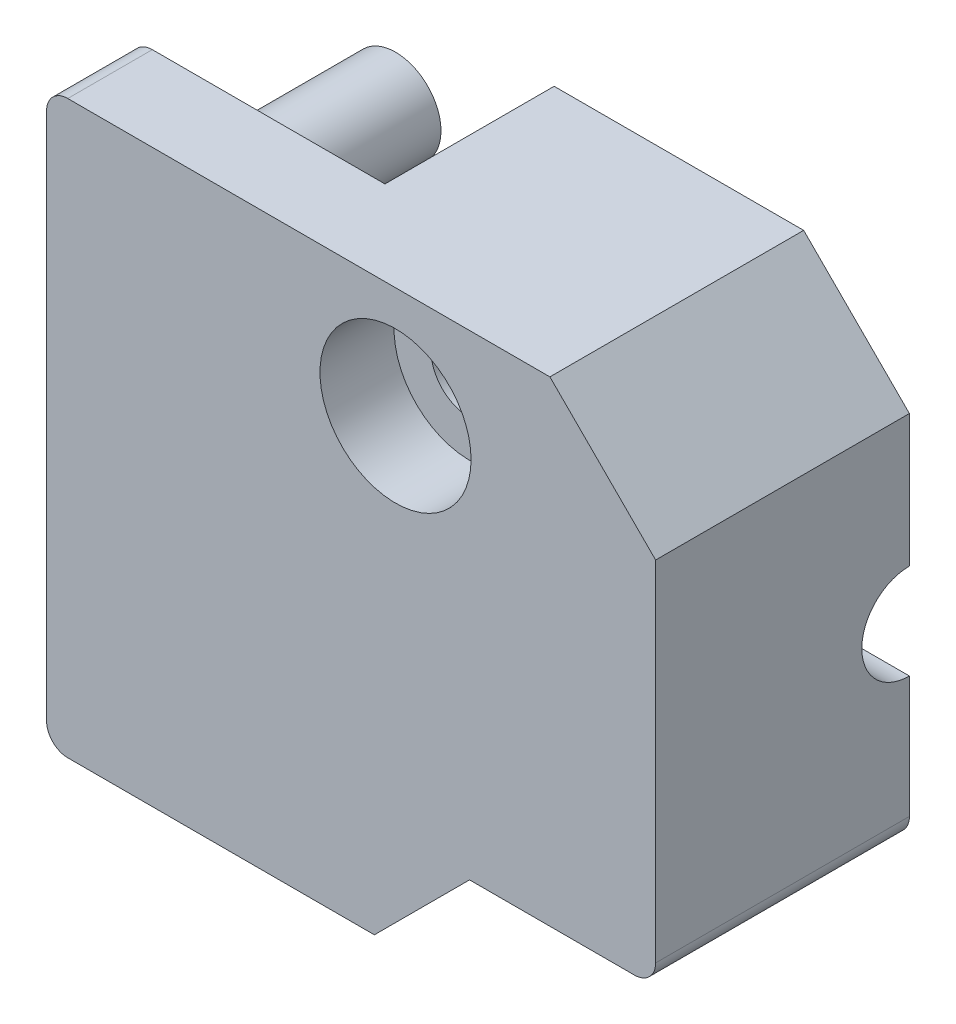
ISO-10303-21;
HEADER;
FILE_DESCRIPTION(('STEP AP214'),'2;1');
FILE_NAME('part.step','',(''),(''),'','','');
FILE_SCHEMA(('AUTOMOTIVE_DESIGN { 1 0 10303 214 1 1 1 1 }'));
ENDSEC;
DATA;
#1=APPLICATION_CONTEXT('core data for automotive mechanical design processes');
#2=APPLICATION_PROTOCOL_DEFINITION('international standard','automotive_design',2000,#1);
#3=PRODUCT_CONTEXT('',#1,'mechanical');
#4=PRODUCT('Part','Part','',(#3));
#5=PRODUCT_RELATED_PRODUCT_CATEGORY('part','',(#4));
#6=PRODUCT_DEFINITION_FORMATION('','',#4);
#7=PRODUCT_DEFINITION_CONTEXT('part definition',#1,'design');
#8=PRODUCT_DEFINITION('design','',#6,#7);
#9=PRODUCT_DEFINITION_SHAPE('','',#8);
#10=(LENGTH_UNIT() NAMED_UNIT(*) SI_UNIT(.MILLI.,.METRE.));
#11=(NAMED_UNIT(*) PLANE_ANGLE_UNIT() SI_UNIT($,.RADIAN.));
#12=(NAMED_UNIT(*) SI_UNIT($,.STERADIAN.) SOLID_ANGLE_UNIT());
#13=UNCERTAINTY_MEASURE_WITH_UNIT(LENGTH_MEASURE(1.E-05),#10,'distance_accuracy_value','');
#14=(GEOMETRIC_REPRESENTATION_CONTEXT(3) GLOBAL_UNCERTAINTY_ASSIGNED_CONTEXT((#13)) GLOBAL_UNIT_ASSIGNED_CONTEXT((#10,
#11,#12)) REPRESENTATION_CONTEXT('',''));
#15=CARTESIAN_POINT('',(0.,0.,0.));
#16=DIRECTION('',(0.,0.,1.));
#17=DIRECTION('',(1.,0.,0.));
#18=AXIS2_PLACEMENT_3D('',#15,#16,#17);
#19=CARTESIAN_POINT('',(4.5,22.5,-8.));
#20=DIRECTION('',(0.,0.,1.));
#21=DIRECTION('',(1.,0.,0.));
#22=AXIS2_PLACEMENT_3D('',#19,#20,#21);
#23=PLANE('',#22);
#24=DIRECTION('',(-1.,0.,0.));
#25=VECTOR('',#24,1.);
#26=CARTESIAN_POINT('',(4.5,7.15,-8.));
#27=LINE('',#26,#25);
#28=CARTESIAN_POINT('',(13.,7.15,-8.));
#29=VERTEX_POINT('',#28);
#30=CARTESIAN_POINT('',(11.5162311820521,7.15,-8.));
#31=VERTEX_POINT('',#30);
#32=EDGE_CURVE('E393',#29,#31,#27,.T.);
#33=ORIENTED_EDGE('',*,*,#32,.F.);
#34=DIRECTION('',(0.,-1.,0.));
#35=VECTOR('',#34,1.);
#36=CARTESIAN_POINT('',(13.,22.5,-8.));
#37=LINE('',#36,#35);
#38=CARTESIAN_POINT('',(13.,11.25,-8.));
#39=VERTEX_POINT('',#38);
#40=EDGE_CURVE('E569',#39,#29,#37,.T.);
#41=ORIENTED_EDGE('',*,*,#40,.F.);
#42=DIRECTION('',(-1.,0.,0.));
#43=VECTOR('',#42,1.);
#44=CARTESIAN_POINT('',(26.3639610306789,11.25,-8.));
#45=LINE('',#44,#43);
#46=CARTESIAN_POINT('',(20.,11.25,-8.));
#47=VERTEX_POINT('',#46);
#48=EDGE_CURVE('E385',#47,#39,#45,.T.);
#49=ORIENTED_EDGE('',*,*,#48,.F.);
#50=DIRECTION('',(0.,1.,0.));
#51=VECTOR('',#50,1.);
#52=CARTESIAN_POINT('',(20.,0.,-8.));
#53=LINE('',#52,#51);
#54=CARTESIAN_POINT('',(20.,4.5,-8.));
#55=VERTEX_POINT('',#54);
#56=EDGE_CURVE('E402',#55,#47,#53,.T.);
#57=ORIENTED_EDGE('',*,*,#56,.F.);
#58=DIRECTION('',(1.,0.,0.));
#59=VECTOR('',#58,1.);
#60=CARTESIAN_POINT('',(0.,4.5,-8.));
#61=LINE('',#60,#59);
#62=CARTESIAN_POINT('',(15.2819293264239,4.5,-8.));
#63=VERTEX_POINT('',#62);
#64=EDGE_CURVE('E403',#63,#55,#61,.T.);
#65=ORIENTED_EDGE('',*,*,#64,.F.);
#66=CARTESIAN_POINT('',(15.2819293264239,8.5,-8.));
#67=DIRECTION('',(0.,0.,1.));
#68=DIRECTION('',(1.,0.,0.));
#69=AXIS2_PLACEMENT_3D('',#66,#67,#68);
#70=CIRCLE('',#69,4.);
#71=CARTESIAN_POINT('',(11.5316930389721,7.10869565217391,-8.));
#72=VERTEX_POINT('',#71);
#73=EDGE_CURVE('E419',#63,#72,#70,.F.);
#74=ORIENTED_EDGE('',*,*,#73,.T.);
#75=CARTESIAN_POINT('',(4.5,4.5,-8.));
#76=DIRECTION('',(0.,0.,1.));
#77=DIRECTION('',(1.,0.,0.));
#78=AXIS2_PLACEMENT_3D('',#75,#76,#77);
#79=CIRCLE('',#78,7.5);
#80=EDGE_CURVE('E417',#31,#72,#79,.F.);
#81=ORIENTED_EDGE('',*,*,#80,.F.);
#82=EDGE_LOOP('',(#33,#41,#49,#57,#65,#74,#81));
#83=FACE_BOUND('',#82,.T.);
#84=CARTESIAN_POINT('',(16.5,7.875,-8.));
#85=DIRECTION('',(0.,0.,1.));
#86=DIRECTION('',(1.,0.,0.));
#87=AXIS2_PLACEMENT_3D('',#84,#85,#86);
#88=CIRCLE('',#87,1.75);
#89=CARTESIAN_POINT('',(18.25,7.875,-8.));
#90=VERTEX_POINT('',#89);
#91=EDGE_CURVE('E310',#90,#90,#88,.F.);
#92=ORIENTED_EDGE('',*,*,#91,.F.);
#93=EDGE_LOOP('',(#92));
#94=FACE_BOUND('',#93,.T.);
#95=ADVANCED_FACE('F40',(#83,#94),#23,.F.);
#96=CARTESIAN_POINT('',(4.5,4.5,-35.3221521846285));
#97=DIRECTION('',(0.,0.,1.));
#98=DIRECTION('',(1.,0.,0.));
#99=AXIS2_PLACEMENT_3D('',#96,#97,#98);
#100=CYLINDRICAL_SURFACE('',#99,7.5);
#101=DIRECTION('',(0.,0.,1.));
#102=VECTOR('',#101,1.);
#103=CARTESIAN_POINT('',(11.5162311820521,7.15000000000001,-35.3221521846285));
#104=LINE('',#103,#102);
#105=CARTESIAN_POINT('',(11.5162311820521,7.15,-1.65));
#106=VERTEX_POINT('',#105);
#107=EDGE_CURVE('E568',#31,#106,#104,.T.);
#108=ORIENTED_EDGE('',*,*,#107,.F.);
#109=ORIENTED_EDGE('',*,*,#80,.T.);
#110=DIRECTION('',(0.,0.,1.));
#111=VECTOR('',#110,1.);
#112=CARTESIAN_POINT('',(11.5316930389721,7.10869565217391,-35.3221521846285));
#113=LINE('',#112,#111);
#114=CARTESIAN_POINT('',(11.5316930389721,7.10869565217391,0.));
#115=VERTEX_POINT('',#114);
#116=EDGE_CURVE('E437',#72,#115,#113,.T.);
#117=ORIENTED_EDGE('',*,*,#116,.T.);
#118=CARTESIAN_POINT('',(4.5,4.5,0.));
#119=DIRECTION('',(0.,0.,-1.));
#120=DIRECTION('',(-1.,0.,0.));
#121=AXIS2_PLACEMENT_3D('',#118,#119,#120);
#122=CIRCLE('',#121,7.5);
#123=CARTESIAN_POINT('',(4.5,12.,0.));
#124=VERTEX_POINT('',#123);
#125=EDGE_CURVE('E420',#115,#124,#122,.F.);
#126=ORIENTED_EDGE('',*,*,#125,.T.);
#127=DIRECTION('',(0.,0.,1.));
#128=VECTOR('',#127,1.);
#129=CARTESIAN_POINT('',(4.5,12.,-35.3221521846285));
#130=LINE('',#129,#128);
#131=CARTESIAN_POINT('',(4.5,12.,-1.65));
#132=VERTEX_POINT('',#131);
#133=EDGE_CURVE('E449',#132,#124,#130,.T.);
#134=ORIENTED_EDGE('',*,*,#133,.F.);
#135=CARTESIAN_POINT('',(4.5,4.5,-1.65));
#136=DIRECTION('',(0.,0.,-1.));
#137=DIRECTION('',(-1.,0.,0.));
#138=AXIS2_PLACEMENT_3D('',#135,#136,#137);
#139=CIRCLE('',#138,7.5);
#140=EDGE_CURVE('E579',#106,#132,#139,.F.);
#141=ORIENTED_EDGE('',*,*,#140,.F.);
#142=EDGE_LOOP('',(#108,#109,#117,#126,#134,#141));
#143=FACE_BOUND('',#142,.T.);
#144=ADVANCED_FACE('F483',(#143),#100,.F.);
#145=CARTESIAN_POINT('',(4.5,0.,-35.3221521846285));
#146=DIRECTION('',(1.,0.,0.));
#147=DIRECTION('',(0.,0.,-1.));
#148=AXIS2_PLACEMENT_3D('',#145,#146,#147);
#149=PLANE('',#148);
#150=DIRECTION('',(0.,-1.,0.));
#151=VECTOR('',#150,1.);
#152=CARTESIAN_POINT('',(4.5,7.15,-1.65));
#153=LINE('',#152,#151);
#154=CARTESIAN_POINT('',(4.5,15.,-1.65));
#155=VERTEX_POINT('',#154);
#156=EDGE_CURVE('E586',#155,#132,#153,.T.);
#157=ORIENTED_EDGE('',*,*,#156,.T.);
#158=ORIENTED_EDGE('',*,*,#133,.T.);
#159=DIRECTION('',(0.,1.,0.));
#160=VECTOR('',#159,1.);
#161=CARTESIAN_POINT('',(4.5,0.,0.));
#162=LINE('',#161,#160);
#163=CARTESIAN_POINT('',(4.5,15.,0.));
#164=VERTEX_POINT('',#163);
#165=EDGE_CURVE('E423',#124,#164,#162,.T.);
#166=ORIENTED_EDGE('',*,*,#165,.T.);
#167=DIRECTION('',(0.,0.,1.));
#168=VECTOR('',#167,1.);
#169=CARTESIAN_POINT('',(4.5,15.,-35.3221521846285));
#170=LINE('',#169,#168);
#171=EDGE_CURVE('E447',#155,#164,#170,.T.);
#172=ORIENTED_EDGE('',*,*,#171,.F.);
#173=EDGE_LOOP('',(#157,#158,#166,#172));
#174=FACE_BOUND('',#173,.T.);
#175=ADVANCED_FACE('F491',(#174),#149,.F.);
#176=CARTESIAN_POINT('',(4.5,22.5,-35.3221521846285));
#177=DIRECTION('',(0.,0.,1.));
#178=DIRECTION('',(1.,0.,0.));
#179=AXIS2_PLACEMENT_3D('',#176,#177,#178);
#180=CYLINDRICAL_SURFACE('',#179,7.5);
#181=DIRECTION('',(0.,0.,1.));
#182=VECTOR('',#181,1.);
#183=CARTESIAN_POINT('',(11.5162311820521,19.85,-35.3221521846285));
#184=LINE('',#183,#182);
#185=CARTESIAN_POINT('',(11.5162311820521,19.85,-1.65));
#186=VERTEX_POINT('',#185);
#187=CARTESIAN_POINT('',(11.5162311820521,19.85,-8.));
#188=VERTEX_POINT('',#187);
#189=EDGE_CURVE('E580',#186,#188,#184,.F.);
#190=ORIENTED_EDGE('',*,*,#189,.F.);
#191=CARTESIAN_POINT('',(4.5,22.5,-1.65));
#192=DIRECTION('',(0.,0.,-1.));
#193=DIRECTION('',(-1.,0.,0.));
#194=AXIS2_PLACEMENT_3D('',#191,#192,#193);
#195=CIRCLE('',#194,7.5);
#196=EDGE_CURVE('E314',#155,#186,#195,.F.);
#197=ORIENTED_EDGE('',*,*,#196,.F.);
#198=ORIENTED_EDGE('',*,*,#171,.T.);
#199=CARTESIAN_POINT('',(4.5,22.5,0.));
#200=DIRECTION('',(0.,0.,-1.));
#201=DIRECTION('',(-1.,0.,0.));
#202=AXIS2_PLACEMENT_3D('',#199,#200,#201);
#203=CIRCLE('',#202,7.5);
#204=CARTESIAN_POINT('',(12.,22.5,0.));
#205=VERTEX_POINT('',#204);
#206=EDGE_CURVE('E427',#164,#205,#203,.F.);
#207=ORIENTED_EDGE('',*,*,#206,.T.);
#208=DIRECTION('',(0.,0.,1.));
#209=VECTOR('',#208,1.);
#210=CARTESIAN_POINT('',(12.,22.5,-35.3221521846285));
#211=LINE('',#210,#209);
#212=CARTESIAN_POINT('',(12.,22.5,-8.));
#213=VERTEX_POINT('',#212);
#214=EDGE_CURVE('E445',#213,#205,#211,.T.);
#215=ORIENTED_EDGE('',*,*,#214,.F.);
#216=CARTESIAN_POINT('',(4.5,22.5,-8.));
#217=DIRECTION('',(0.,0.,1.));
#218=DIRECTION('',(1.,0.,0.));
#219=AXIS2_PLACEMENT_3D('',#216,#217,#218);
#220=CIRCLE('',#219,7.5);
#221=EDGE_CURVE('E414',#213,#188,#220,.F.);
#222=ORIENTED_EDGE('',*,*,#221,.T.);
#223=EDGE_LOOP('',(#190,#197,#198,#207,#215,#222));
#224=FACE_BOUND('',#223,.T.);
#225=ADVANCED_FACE('F500',(#224),#180,.F.);
#226=CARTESIAN_POINT('',(16.5,21.75,-8.));
#227=DIRECTION('',(0.,0.,1.));
#228=DIRECTION('',(1.,0.,0.));
#229=AXIS2_PLACEMENT_3D('',#226,#227,#228);
#230=CIRCLE('',#229,1.8288);
#231=CARTESIAN_POINT('',(18.3288,21.75,-8.));
#232=VERTEX_POINT('',#231);
#233=EDGE_CURVE('E262',#232,#232,#230,.T.);
#234=ORIENTED_EDGE('',*,*,#233,.T.);
#235=EDGE_LOOP('',(#234));
#236=FACE_BOUND('',#235,.T.);
#237=DIRECTION('',(-1.,0.,0.));
#238=VECTOR('',#237,1.);
#239=CARTESIAN_POINT('',(0.,27.,-8.));
#240=LINE('',#239,#238);
#241=CARTESIAN_POINT('',(23.8,27.,-8.));
#242=VERTEX_POINT('',#241);
#243=CARTESIAN_POINT('',(12.,27.,-8.));
#244=VERTEX_POINT('',#243);
#245=EDGE_CURVE('E326',#242,#244,#240,.T.);
#246=ORIENTED_EDGE('',*,*,#245,.F.);
#247=DIRECTION('',(0.707106781186548,-0.707106781186547,0.));
#248=VECTOR('',#247,1.);
#249=CARTESIAN_POINT('',(28.8,22.,-8.));
#250=LINE('',#249,#248);
#251=CARTESIAN_POINT('',(28.8,22.,-8.));
#252=VERTEX_POINT('',#251);
#253=EDGE_CURVE('E321',#242,#252,#250,.T.);
#254=ORIENTED_EDGE('',*,*,#253,.T.);
#255=DIRECTION('',(0.,1.,0.));
#256=VECTOR('',#255,1.);
#257=CARTESIAN_POINT('',(28.8,0.,-8.));
#258=LINE('',#257,#256);
#259=CARTESIAN_POINT('',(28.8,15.75,-8.));
#260=VERTEX_POINT('',#259);
#261=EDGE_CURVE('E247',#260,#252,#258,.T.);
#262=ORIENTED_EDGE('',*,*,#261,.F.);
#263=DIRECTION('',(-1.,0.,0.));
#264=VECTOR('',#263,1.);
#265=CARTESIAN_POINT('',(28.8,15.75,-8.));
#266=LINE('',#265,#264);
#267=CARTESIAN_POINT('',(25.8,15.75,-8.));
#268=VERTEX_POINT('',#267);
#269=EDGE_CURVE('E232',#260,#268,#266,.T.);
#270=ORIENTED_EDGE('',*,*,#269,.T.);
#271=DIRECTION('',(0.,1.,0.));
#272=VECTOR('',#271,1.);
#273=CARTESIAN_POINT('',(25.8,0.,-8.));
#274=LINE('',#273,#272);
#275=CARTESIAN_POINT('',(25.8,21.05,-8.));
#276=VERTEX_POINT('',#275);
#277=EDGE_CURVE('E243',#268,#276,#274,.T.);
#278=ORIENTED_EDGE('',*,*,#277,.T.);
#279=DIRECTION('',(-1.,0.,0.));
#280=VECTOR('',#279,1.);
#281=CARTESIAN_POINT('',(25.8,21.05,-8.));
#282=LINE('',#281,#280);
#283=CARTESIAN_POINT('',(20.,21.05,-8.));
#284=VERTEX_POINT('',#283);
#285=EDGE_CURVE('E574',#276,#284,#282,.T.);
#286=ORIENTED_EDGE('',*,*,#285,.T.);
#287=CARTESIAN_POINT('',(20.,15.75,-8.));
#288=VERTEX_POINT('',#287);
#289=EDGE_CURVE('E398',#288,#284,#53,.T.);
#290=ORIENTED_EDGE('',*,*,#289,.F.);
#291=DIRECTION('',(-1.,0.,0.));
#292=VECTOR('',#291,1.);
#293=CARTESIAN_POINT('',(26.3639610306789,15.75,-8.));
#294=LINE('',#293,#292);
#295=CARTESIAN_POINT('',(13.,15.75,-8.));
#296=VERTEX_POINT('',#295);
#297=EDGE_CURVE('E388',#296,#288,#294,.F.);
#298=ORIENTED_EDGE('',*,*,#297,.F.);
#299=DIRECTION('',(0.,-1.,0.));
#300=VECTOR('',#299,1.);
#301=CARTESIAN_POINT('',(13.,22.5,-8.));
#302=LINE('',#301,#300);
#303=CARTESIAN_POINT('',(13.,19.85,-8.));
#304=VERTEX_POINT('',#303);
#305=EDGE_CURVE('E562',#304,#296,#302,.T.);
#306=ORIENTED_EDGE('',*,*,#305,.F.);
#307=DIRECTION('',(1.,0.,0.));
#308=VECTOR('',#307,1.);
#309=CARTESIAN_POINT('',(4.5,19.85,-8.));
#310=LINE('',#309,#308);
#311=EDGE_CURVE('E395',#188,#304,#310,.T.);
#312=ORIENTED_EDGE('',*,*,#311,.F.);
#313=ORIENTED_EDGE('',*,*,#221,.F.);
#314=DIRECTION('',(0.,1.,0.));
#315=VECTOR('',#314,1.);
#316=CARTESIAN_POINT('',(12.,0.,-8.));
#317=LINE('',#316,#315);
#318=EDGE_CURVE('E412',#213,#244,#317,.T.);
#319=ORIENTED_EDGE('',*,*,#318,.T.);
#320=EDGE_LOOP('',(#246,#254,#262,#270,#278,#286,#290,#298,#306,#312,#313,#319));
#321=FACE_BOUND('',#320,.T.);
#322=ADVANCED_FACE('F274',(#236,#321),#23,.F.);
#323=CARTESIAN_POINT('',(26.3639610306789,13.5,-8.));
#324=DIRECTION('',(-1.,0.,0.));
#325=DIRECTION('',(0.,0.,1.));
#326=AXIS2_PLACEMENT_3D('',#323,#324,#325);
#327=CYLINDRICAL_SURFACE('',#326,2.25);
#328=ORIENTED_EDGE('',*,*,#48,.T.);
#329=CARTESIAN_POINT('',(13.,13.5,-8.));
#330=DIRECTION('',(-1.,0.,0.));
#331=DIRECTION('',(0.,0.,1.));
#332=AXIS2_PLACEMENT_3D('',#329,#330,#331);
#333=CIRCLE('',#332,2.25);
#334=EDGE_CURVE('E390',#39,#296,#333,.T.);
#335=ORIENTED_EDGE('',*,*,#334,.T.);
#336=ORIENTED_EDGE('',*,*,#297,.T.);
#337=CARTESIAN_POINT('',(20.,13.5,-8.));
#338=DIRECTION('',(-1.,0.,0.));
#339=DIRECTION('',(0.,0.,1.));
#340=AXIS2_PLACEMENT_3D('',#337,#338,#339);
#341=CIRCLE('',#340,2.25);
#342=EDGE_CURVE('E424',#47,#288,#341,.T.);
#343=ORIENTED_EDGE('',*,*,#342,.F.);
#344=EDGE_LOOP('',(#328,#335,#336,#343));
#345=FACE_BOUND('',#344,.T.);
#346=ADVANCED_FACE('F499',(#345),#327,.F.);
#347=CARTESIAN_POINT('',(20.,4.5,4.));
#348=DIRECTION('',(-1.,0.,0.));
#349=DIRECTION('',(0.,0.,1.));
#350=AXIS2_PLACEMENT_3D('',#347,#348,#349);
#351=PLANE('',#350);
#352=ORIENTED_EDGE('',*,*,#289,.T.);
#353=CARTESIAN_POINT('',(20.,13.5,-8.));
#354=DIRECTION('',(1.,0.,0.));
#355=DIRECTION('',(0.,0.,-1.));
#356=AXIS2_PLACEMENT_3D('',#353,#354,#355);
#357=CIRCLE('',#356,7.55);
#358=CARTESIAN_POINT('',(20.,9.74500332889628,-1.45));
#359=VERTEX_POINT('',#358);
#360=EDGE_CURVE('E578',#284,#359,#357,.T.);
#361=ORIENTED_EDGE('',*,*,#360,.T.);
#362=DIRECTION('',(0.,-1.,0.));
#363=VECTOR('',#362,1.);
#364=CARTESIAN_POINT('',(20.,0.,-1.45));
#365=LINE('',#364,#363);
#366=CARTESIAN_POINT('',(20.,4.5,-1.45));
#367=VERTEX_POINT('',#366);
#368=EDGE_CURVE('E299',#359,#367,#365,.T.);
#369=ORIENTED_EDGE('',*,*,#368,.T.);
#370=DIRECTION('',(0.,0.,1.));
#371=VECTOR('',#370,1.);
#372=CARTESIAN_POINT('',(20.,4.5,-35.3221521846285));
#373=LINE('',#372,#371);
#374=EDGE_CURVE('E289',#55,#367,#373,.T.);
#375=ORIENTED_EDGE('',*,*,#374,.F.);
#376=ORIENTED_EDGE('',*,*,#56,.T.);
#377=ORIENTED_EDGE('',*,*,#342,.T.);
#378=EDGE_LOOP('',(#352,#361,#369,#375,#376,#377));
#379=FACE_BOUND('',#378,.T.);
#380=ADVANCED_FACE('F507',(#379),#351,.F.);
#381=CARTESIAN_POINT('',(1.,27.,4.));
#382=DIRECTION('',(0.,-1.,0.));
#383=DIRECTION('',(0.,0.,-1.));
#384=AXIS2_PLACEMENT_3D('',#381,#382,#383);
#385=PLANE('',#384);
#386=DIRECTION('',(-1.,0.,0.));
#387=VECTOR('',#386,1.);
#388=CARTESIAN_POINT('',(1.,27.,4.));
#389=LINE('',#388,#387);
#390=CARTESIAN_POINT('',(23.8,27.,4.));
#391=VERTEX_POINT('',#390);
#392=CARTESIAN_POINT('',(1.,27.,4.));
#393=VERTEX_POINT('',#392);
#394=EDGE_CURVE('E335',#391,#393,#389,.T.);
#395=ORIENTED_EDGE('',*,*,#394,.F.);
#396=DIRECTION('',(0.,0.,-1.));
#397=VECTOR('',#396,1.);
#398=CARTESIAN_POINT('',(23.8,27.,-8.));
#399=LINE('',#398,#397);
#400=EDGE_CURVE('E319',#391,#242,#399,.T.);
#401=ORIENTED_EDGE('',*,*,#400,.T.);
#402=ORIENTED_EDGE('',*,*,#245,.T.);
#403=DIRECTION('',(0.,0.,1.));
#404=VECTOR('',#403,1.);
#405=CARTESIAN_POINT('',(12.,27.,-35.3221521846285));
#406=LINE('',#405,#404);
#407=CARTESIAN_POINT('',(12.,27.,0.));
#408=VERTEX_POINT('',#407);
#409=EDGE_CURVE('E443',#244,#408,#406,.T.);
#410=ORIENTED_EDGE('',*,*,#409,.T.);
#411=DIRECTION('',(-1.,0.,0.));
#412=VECTOR('',#411,1.);
#413=CARTESIAN_POINT('',(1.,27.,0.));
#414=LINE('',#413,#412);
#415=CARTESIAN_POINT('',(1.,27.,0.));
#416=VERTEX_POINT('',#415);
#417=EDGE_CURVE('E362',#408,#416,#414,.T.);
#418=ORIENTED_EDGE('',*,*,#417,.T.);
#419=DIRECTION('',(0.,0.,-1.));
#420=VECTOR('',#419,1.);
#421=CARTESIAN_POINT('',(1.,27.,4.));
#422=LINE('',#421,#420);
#423=EDGE_CURVE('E340',#393,#416,#422,.T.);
#424=ORIENTED_EDGE('',*,*,#423,.F.);
#425=EDGE_LOOP('',(#395,#401,#402,#410,#418,#424));
#426=FACE_BOUND('',#425,.T.);
#427=ADVANCED_FACE('F338',(#426),#385,.F.);
#428=CARTESIAN_POINT('',(1.,26.,4.));
#429=DIRECTION('',(0.,0.,-1.));
#430=DIRECTION('',(-1.,0.,0.));
#431=AXIS2_PLACEMENT_3D('',#428,#429,#430);
#432=CYLINDRICAL_SURFACE('',#431,1.);
#433=CARTESIAN_POINT('',(1.,26.,0.));
#434=DIRECTION('',(0.,0.,1.));
#435=DIRECTION('',(1.,0.,0.));
#436=AXIS2_PLACEMENT_3D('',#433,#434,#435);
#437=CIRCLE('',#436,1.);
#438=CARTESIAN_POINT('',(0.,26.,0.));
#439=VERTEX_POINT('',#438);
#440=EDGE_CURVE('E364',#416,#439,#437,.T.);
#441=ORIENTED_EDGE('',*,*,#440,.T.);
#442=DIRECTION('',(0.,0.,-1.));
#443=VECTOR('',#442,1.);
#444=CARTESIAN_POINT('',(0.,26.,4.));
#445=LINE('',#444,#443);
#446=CARTESIAN_POINT('',(0.,26.,4.));
#447=VERTEX_POINT('',#446);
#448=EDGE_CURVE('E381',#447,#439,#445,.T.);
#449=ORIENTED_EDGE('',*,*,#448,.F.);
#450=CARTESIAN_POINT('',(1.,26.,4.));
#451=DIRECTION('',(0.,0.,1.));
#452=DIRECTION('',(1.,0.,0.));
#453=AXIS2_PLACEMENT_3D('',#450,#451,#452);
#454=CIRCLE('',#453,1.);
#455=EDGE_CURVE('E342',#393,#447,#454,.T.);
#456=ORIENTED_EDGE('',*,*,#455,.F.);
#457=ORIENTED_EDGE('',*,*,#423,.T.);
#458=EDGE_LOOP('',(#441,#449,#456,#457));
#459=FACE_BOUND('',#458,.T.);
#460=ADVANCED_FACE('F646',(#459),#432,.T.);
#461=CARTESIAN_POINT('',(0.,1.00000000000001,4.));
#462=DIRECTION('',(1.,0.,0.));
#463=DIRECTION('',(0.,0.,-1.));
#464=AXIS2_PLACEMENT_3D('',#461,#462,#463);
#465=PLANE('',#464);
#466=DIRECTION('',(0.,-1.,0.));
#467=VECTOR('',#466,1.);
#468=CARTESIAN_POINT('',(0.,1.00000000000001,0.));
#469=LINE('',#468,#467);
#470=CARTESIAN_POINT('',(0.,1.00000000000001,0.));
#471=VERTEX_POINT('',#470);
#472=EDGE_CURVE('E367',#439,#471,#469,.T.);
#473=ORIENTED_EDGE('',*,*,#472,.T.);
#474=DIRECTION('',(0.,0.,-1.));
#475=VECTOR('',#474,1.);
#476=CARTESIAN_POINT('',(0.,1.00000000000001,4.));
#477=LINE('',#476,#475);
#478=CARTESIAN_POINT('',(0.,1.00000000000001,4.));
#479=VERTEX_POINT('',#478);
#480=EDGE_CURVE('E378',#479,#471,#477,.T.);
#481=ORIENTED_EDGE('',*,*,#480,.F.);
#482=DIRECTION('',(0.,-1.,0.));
#483=VECTOR('',#482,1.);
#484=CARTESIAN_POINT('',(0.,1.00000000000001,4.));
#485=LINE('',#484,#483);
#486=EDGE_CURVE('E345',#447,#479,#485,.T.);
#487=ORIENTED_EDGE('',*,*,#486,.F.);
#488=ORIENTED_EDGE('',*,*,#448,.T.);
#489=EDGE_LOOP('',(#473,#481,#487,#488));
#490=FACE_BOUND('',#489,.T.);
#491=ADVANCED_FACE('F653',(#490),#465,.F.);
#492=CARTESIAN_POINT('',(1.,1.,4.));
#493=DIRECTION('',(0.,0.,-1.));
#494=DIRECTION('',(-1.,0.,0.));
#495=AXIS2_PLACEMENT_3D('',#492,#493,#494);
#496=CYLINDRICAL_SURFACE('',#495,1.);
#497=CARTESIAN_POINT('',(1.,1.,0.));
#498=DIRECTION('',(0.,0.,1.));
#499=DIRECTION('',(-1.,0.,0.));
#500=AXIS2_PLACEMENT_3D('',#497,#498,#499);
#501=CIRCLE('',#500,1.);
#502=CARTESIAN_POINT('',(1.00000000000001,0.,0.));
#503=VERTEX_POINT('',#502);
#504=EDGE_CURVE('E369',#471,#503,#501,.T.);
#505=ORIENTED_EDGE('',*,*,#504,.T.);
#506=DIRECTION('',(0.,0.,-1.));
#507=VECTOR('',#506,1.);
#508=CARTESIAN_POINT('',(1.00000000000001,0.,4.));
#509=LINE('',#508,#507);
#510=CARTESIAN_POINT('',(1.00000000000001,0.,4.));
#511=VERTEX_POINT('',#510);
#512=EDGE_CURVE('E375',#511,#503,#509,.T.);
#513=ORIENTED_EDGE('',*,*,#512,.F.);
#514=CARTESIAN_POINT('',(1.,1.,4.));
#515=DIRECTION('',(0.,0.,1.));
#516=DIRECTION('',(-1.,0.,0.));
#517=AXIS2_PLACEMENT_3D('',#514,#515,#516);
#518=CIRCLE('',#517,1.);
#519=EDGE_CURVE('E354',#479,#511,#518,.T.);
#520=ORIENTED_EDGE('',*,*,#519,.F.);
#521=ORIENTED_EDGE('',*,*,#480,.T.);
#522=EDGE_LOOP('',(#505,#513,#520,#521));
#523=FACE_BOUND('',#522,.T.);
#524=ADVANCED_FACE('F657',(#523),#496,.T.);
#525=CARTESIAN_POINT('',(1.00000000000001,0.,4.));
#526=DIRECTION('',(0.,1.,0.));
#527=DIRECTION('',(0.,0.,1.));
#528=AXIS2_PLACEMENT_3D('',#525,#526,#527);
#529=PLANE('',#528);
#530=DIRECTION('',(1.,0.,0.));
#531=VECTOR('',#530,1.);
#532=CARTESIAN_POINT('',(1.00000000000001,0.,0.));
#533=LINE('',#532,#531);
#534=CARTESIAN_POINT('',(15.5,0.,0.));
#535=VERTEX_POINT('',#534);
#536=EDGE_CURVE('E348',#503,#535,#533,.T.);
#537=ORIENTED_EDGE('',*,*,#536,.T.);
#538=DIRECTION('',(0.,0.,-1.));
#539=VECTOR('',#538,1.);
#540=CARTESIAN_POINT('',(15.5,0.,4.));
#541=LINE('',#540,#539);
#542=CARTESIAN_POINT('',(15.5,0.,4.));
#543=VERTEX_POINT('',#542);
#544=EDGE_CURVE('E372',#543,#535,#541,.T.);
#545=ORIENTED_EDGE('',*,*,#544,.F.);
#546=DIRECTION('',(1.,0.,0.));
#547=VECTOR('',#546,1.);
#548=CARTESIAN_POINT('',(1.00000000000001,0.,4.));
#549=LINE('',#548,#547);
#550=EDGE_CURVE('E356',#511,#543,#549,.T.);
#551=ORIENTED_EDGE('',*,*,#550,.F.);
#552=ORIENTED_EDGE('',*,*,#512,.T.);
#553=EDGE_LOOP('',(#537,#545,#551,#552));
#554=FACE_BOUND('',#553,.T.);
#555=ADVANCED_FACE('F663',(#554),#529,.F.);
#556=CARTESIAN_POINT('',(15.5,0.,4.));
#557=DIRECTION('',(-0.707106781186547,0.707106781186548,0.));
#558=DIRECTION('',(-0.707106781186548,-0.707106781186547,0.));
#559=AXIS2_PLACEMENT_3D('',#556,#557,#558);
#560=PLANE('',#559);
#561=DIRECTION('',(0.707106781186548,0.707106781186547,0.));
#562=VECTOR('',#561,1.);
#563=CARTESIAN_POINT('',(15.5,0.,0.));
#564=LINE('',#563,#562);
#565=CARTESIAN_POINT('',(20.,4.5,0.));
#566=VERTEX_POINT('',#565);
#567=EDGE_CURVE('E343',#535,#566,#564,.T.);
#568=ORIENTED_EDGE('',*,*,#567,.T.);
#569=DIRECTION('',(0.,0.,-1.));
#570=VECTOR('',#569,1.);
#571=CARTESIAN_POINT('',(20.,4.5,4.));
#572=LINE('',#571,#570);
#573=CARTESIAN_POINT('',(20.,4.5,4.));
#574=VERTEX_POINT('',#573);
#575=EDGE_CURVE('E361',#574,#566,#572,.T.);
#576=ORIENTED_EDGE('',*,*,#575,.F.);
#577=DIRECTION('',(0.707106781186548,0.707106781186547,0.));
#578=VECTOR('',#577,1.);
#579=CARTESIAN_POINT('',(15.5,0.,4.));
#580=LINE('',#579,#578);
#581=EDGE_CURVE('E358',#543,#574,#580,.T.);
#582=ORIENTED_EDGE('',*,*,#581,.F.);
#583=ORIENTED_EDGE('',*,*,#544,.T.);
#584=EDGE_LOOP('',(#568,#576,#582,#583));
#585=FACE_BOUND('',#584,.T.);
#586=ADVANCED_FACE('F665',(#585),#560,.F.);
#587=CARTESIAN_POINT('',(1.,26.,4.));
#588=DIRECTION('',(0.,0.,1.));
#589=DIRECTION('',(1.,0.,0.));
#590=AXIS2_PLACEMENT_3D('',#587,#588,#589);
#591=PLANE('',#590);
#592=CARTESIAN_POINT('',(16.5,21.75,4.));
#593=DIRECTION('',(0.,0.,1.));
#594=DIRECTION('',(1.,0.,0.));
#595=AXIS2_PLACEMENT_3D('',#592,#593,#594);
#596=CIRCLE('',#595,3.57250999999999);
#597=CARTESIAN_POINT('',(20.07251,21.75,4.));
#598=VERTEX_POINT('',#597);
#599=EDGE_CURVE('E708',#598,#598,#596,.T.);
#600=ORIENTED_EDGE('',*,*,#599,.F.);
#601=EDGE_LOOP('',(#600));
#602=FACE_BOUND('',#601,.T.);
#603=DIRECTION('',(-1.,0.,0.));
#604=VECTOR('',#603,1.);
#605=CARTESIAN_POINT('',(25.8,4.5,4.));
#606=LINE('',#605,#604);
#607=CARTESIAN_POINT('',(27.8,4.5,4.));
#608=VERTEX_POINT('',#607);
#609=EDGE_CURVE('E293',#608,#574,#606,.T.);
#610=ORIENTED_EDGE('',*,*,#609,.F.);
#611=CARTESIAN_POINT('',(27.8,5.5,4.));
#612=DIRECTION('',(0.,0.,1.));
#613=DIRECTION('',(1.,0.,0.));
#614=AXIS2_PLACEMENT_3D('',#611,#612,#613);
#615=CIRCLE('',#614,1.);
#616=CARTESIAN_POINT('',(28.8,5.5,4.));
#617=VERTEX_POINT('',#616);
#618=EDGE_CURVE('E12',#608,#617,#615,.T.);
#619=ORIENTED_EDGE('',*,*,#618,.T.);
#620=DIRECTION('',(0.,-1.,0.));
#621=VECTOR('',#620,1.);
#622=CARTESIAN_POINT('',(28.8,0.,4.));
#623=LINE('',#622,#621);
#624=CARTESIAN_POINT('',(28.8,22.,4.));
#625=VERTEX_POINT('',#624);
#626=EDGE_CURVE('E249',#625,#617,#623,.T.);
#627=ORIENTED_EDGE('',*,*,#626,.F.);
#628=DIRECTION('',(-0.707106781186548,0.707106781186547,0.));
#629=VECTOR('',#628,1.);
#630=CARTESIAN_POINT('',(12.9,37.9,4.));
#631=LINE('',#630,#629);
#632=EDGE_CURVE('E317',#625,#391,#631,.T.);
#633=ORIENTED_EDGE('',*,*,#632,.T.);
#634=ORIENTED_EDGE('',*,*,#394,.T.);
#635=ORIENTED_EDGE('',*,*,#455,.T.);
#636=ORIENTED_EDGE('',*,*,#486,.T.);
#637=ORIENTED_EDGE('',*,*,#519,.T.);
#638=ORIENTED_EDGE('',*,*,#550,.T.);
#639=ORIENTED_EDGE('',*,*,#581,.T.);
#640=EDGE_LOOP('',(#610,#619,#627,#633,#634,#635,#636,#637,#638,#639));
#641=FACE_BOUND('',#640,.T.);
#642=ADVANCED_FACE('F334',(#602,#641),#591,.T.);
#643=CARTESIAN_POINT('',(1.,26.,0.));
#644=DIRECTION('',(0.,0.,1.));
#645=DIRECTION('',(1.,0.,0.));
#646=AXIS2_PLACEMENT_3D('',#643,#644,#645);
#647=PLANE('',#646);
#648=CARTESIAN_POINT('',(4.5,4.5,0.));
#649=DIRECTION('',(0.,0.,1.));
#650=DIRECTION('',(1.,0.,0.));
#651=AXIS2_PLACEMENT_3D('',#648,#649,#650);
#652=CIRCLE('',#651,2.15);
#653=CARTESIAN_POINT('',(6.65,4.5,0.));
#654=VERTEX_POINT('',#653);
#655=EDGE_CURVE('E454',#654,#654,#652,.T.);
#656=ORIENTED_EDGE('',*,*,#655,.T.);
#657=EDGE_LOOP('',(#656));
#658=FACE_BOUND('',#657,.T.);
#659=CARTESIAN_POINT('',(4.5,22.5,0.));
#660=DIRECTION('',(0.,0.,1.));
#661=DIRECTION('',(1.,0.,0.));
#662=AXIS2_PLACEMENT_3D('',#659,#660,#661);
#663=CIRCLE('',#662,2.15);
#664=CARTESIAN_POINT('',(6.65,22.5,0.));
#665=VERTEX_POINT('',#664);
#666=EDGE_CURVE('E350',#665,#665,#663,.T.);
#667=ORIENTED_EDGE('',*,*,#666,.T.);
#668=EDGE_LOOP('',(#667));
#669=FACE_BOUND('',#668,.T.);
#670=ORIENTED_EDGE('',*,*,#417,.F.);
#671=DIRECTION('',(0.,-1.,0.));
#672=VECTOR('',#671,1.);
#673=CARTESIAN_POINT('',(12.,0.,0.));
#674=LINE('',#673,#672);
#675=EDGE_CURVE('E430',#408,#205,#674,.T.);
#676=ORIENTED_EDGE('',*,*,#675,.T.);
#677=ORIENTED_EDGE('',*,*,#206,.F.);
#678=ORIENTED_EDGE('',*,*,#165,.F.);
#679=ORIENTED_EDGE('',*,*,#125,.F.);
#680=CARTESIAN_POINT('',(15.2819293264239,8.5,0.));
#681=DIRECTION('',(0.,0.,-1.));
#682=DIRECTION('',(-1.,0.,0.));
#683=AXIS2_PLACEMENT_3D('',#680,#681,#682);
#684=CIRCLE('',#683,4.);
#685=CARTESIAN_POINT('',(15.2819293264239,4.5,0.));
#686=VERTEX_POINT('',#685);
#687=EDGE_CURVE('E434',#115,#686,#684,.F.);
#688=ORIENTED_EDGE('',*,*,#687,.T.);
#689=DIRECTION('',(-1.,0.,0.));
#690=VECTOR('',#689,1.);
#691=CARTESIAN_POINT('',(0.,4.5,0.));
#692=LINE('',#691,#690);
#693=EDGE_CURVE('E433',#566,#686,#692,.T.);
#694=ORIENTED_EDGE('',*,*,#693,.F.);
#695=ORIENTED_EDGE('',*,*,#567,.F.);
#696=ORIENTED_EDGE('',*,*,#536,.F.);
#697=ORIENTED_EDGE('',*,*,#504,.F.);
#698=ORIENTED_EDGE('',*,*,#472,.F.);
#699=ORIENTED_EDGE('',*,*,#440,.F.);
#700=EDGE_LOOP('',(#670,#676,#677,#678,#679,#688,#694,#695,#696,#697,#698,#699));
#701=FACE_BOUND('',#700,.T.);
#702=ADVANCED_FACE('F464',(#658,#669,#701),#647,.F.);
#703=CARTESIAN_POINT('',(4.5,22.5,-8.));
#704=DIRECTION('',(0.,0.,1.));
#705=DIRECTION('',(1.,0.,0.));
#706=AXIS2_PLACEMENT_3D('',#703,#704,#705);
#707=CYLINDRICAL_SURFACE('',#706,2.15);
#708=CARTESIAN_POINT('',(4.5,22.5,-8.));
#709=DIRECTION('',(0.,0.,1.));
#710=DIRECTION('',(1.,0.,0.));
#711=AXIS2_PLACEMENT_3D('',#708,#709,#710);
#712=CIRCLE('',#711,2.15);
#713=CARTESIAN_POINT('',(6.65,22.5,-8.));
#714=VERTEX_POINT('',#713);
#715=EDGE_CURVE('E365',#714,#714,#712,.T.);
#716=ORIENTED_EDGE('',*,*,#715,.T.);
#717=EDGE_LOOP('',(#716));
#718=FACE_BOUND('',#717,.T.);
#719=ORIENTED_EDGE('',*,*,#666,.F.);
#720=EDGE_LOOP('',(#719));
#721=FACE_BOUND('',#720,.T.);
#722=ADVANCED_FACE('F467',(#718,#721),#707,.T.);
#723=CARTESIAN_POINT('',(4.5,22.5,-8.));
#724=DIRECTION('',(0.,0.,1.));
#725=DIRECTION('',(1.,0.,0.));
#726=AXIS2_PLACEMENT_3D('',#723,#724,#725);
#727=PLANE('',#726);
#728=ORIENTED_EDGE('',*,*,#715,.F.);
#729=EDGE_LOOP('',(#728));
#730=FACE_BOUND('',#729,.T.);
#731=ADVANCED_FACE('F469',(#730),#727,.F.);
#732=CARTESIAN_POINT('',(4.5,4.5,-8.));
#733=DIRECTION('',(0.,0.,1.));
#734=DIRECTION('',(1.,0.,0.));
#735=AXIS2_PLACEMENT_3D('',#732,#733,#734);
#736=CYLINDRICAL_SURFACE('',#735,2.15);
#737=CARTESIAN_POINT('',(4.5,4.5,-8.));
#738=DIRECTION('',(0.,0.,1.));
#739=DIRECTION('',(1.,0.,0.));
#740=AXIS2_PLACEMENT_3D('',#737,#738,#739);
#741=CIRCLE('',#740,2.15);
#742=CARTESIAN_POINT('',(6.65,4.5,-8.));
#743=VERTEX_POINT('',#742);
#744=EDGE_CURVE('E453',#743,#743,#741,.T.);
#745=ORIENTED_EDGE('',*,*,#744,.T.);
#746=EDGE_LOOP('',(#745));
#747=FACE_BOUND('',#746,.T.);
#748=ORIENTED_EDGE('',*,*,#655,.F.);
#749=EDGE_LOOP('',(#748));
#750=FACE_BOUND('',#749,.T.);
#751=ADVANCED_FACE('F475',(#747,#750),#736,.T.);
#752=CARTESIAN_POINT('',(4.5,4.5,-8.));
#753=DIRECTION('',(0.,0.,1.));
#754=DIRECTION('',(1.,0.,0.));
#755=AXIS2_PLACEMENT_3D('',#752,#753,#754);
#756=PLANE('',#755);
#757=ORIENTED_EDGE('',*,*,#744,.F.);
#758=EDGE_LOOP('',(#757));
#759=FACE_BOUND('',#758,.T.);
#760=ADVANCED_FACE('F885',(#759),#756,.F.);
#761=CARTESIAN_POINT('',(12.,0.,-35.3221521846285));
#762=DIRECTION('',(-1.,0.,0.));
#763=DIRECTION('',(0.,0.,1.));
#764=AXIS2_PLACEMENT_3D('',#761,#762,#763);
#765=PLANE('',#764);
#766=ORIENTED_EDGE('',*,*,#318,.F.);
#767=ORIENTED_EDGE('',*,*,#214,.T.);
#768=ORIENTED_EDGE('',*,*,#675,.F.);
#769=ORIENTED_EDGE('',*,*,#409,.F.);
#770=EDGE_LOOP('',(#766,#767,#768,#769));
#771=FACE_BOUND('',#770,.T.);
#772=ADVANCED_FACE('F642',(#771),#765,.T.);
#773=CARTESIAN_POINT('',(0.,4.5,-35.3221521846285));
#774=DIRECTION('',(0.,1.,0.));
#775=DIRECTION('',(0.,0.,1.));
#776=AXIS2_PLACEMENT_3D('',#773,#774,#775);
#777=PLANE('',#776);
#778=DIRECTION('',(-1.,0.,0.));
#779=VECTOR('',#778,1.);
#780=CARTESIAN_POINT('',(28.8,4.5,-8.));
#781=LINE('',#780,#779);
#782=CARTESIAN_POINT('',(27.8,4.5,-8.));
#783=VERTEX_POINT('',#782);
#784=CARTESIAN_POINT('',(25.8,4.5,-8.));
#785=VERTEX_POINT('',#784);
#786=EDGE_CURVE('E231',#783,#785,#781,.T.);
#787=ORIENTED_EDGE('',*,*,#786,.F.);
#788=DIRECTION('',(0.,0.,-1.));
#789=VECTOR('',#788,1.);
#790=CARTESIAN_POINT('',(27.8,4.5,4.));
#791=LINE('',#790,#789);
#792=EDGE_CURVE('E48',#783,#608,#791,.F.);
#793=ORIENTED_EDGE('',*,*,#792,.T.);
#794=ORIENTED_EDGE('',*,*,#609,.T.);
#795=ORIENTED_EDGE('',*,*,#575,.T.);
#796=ORIENTED_EDGE('',*,*,#693,.T.);
#797=DIRECTION('',(0.,0.,1.));
#798=VECTOR('',#797,1.);
#799=CARTESIAN_POINT('',(15.2819293264239,4.5,-35.3221521846285));
#800=LINE('',#799,#798);
#801=EDGE_CURVE('E439',#63,#686,#800,.T.);
#802=ORIENTED_EDGE('',*,*,#801,.F.);
#803=ORIENTED_EDGE('',*,*,#64,.T.);
#804=ORIENTED_EDGE('',*,*,#374,.T.);
#805=DIRECTION('',(-1.,0.,0.));
#806=VECTOR('',#805,1.);
#807=CARTESIAN_POINT('',(25.8,4.5,-1.45));
#808=LINE('',#807,#806);
#809=CARTESIAN_POINT('',(25.8,4.5,-1.45));
#810=VERTEX_POINT('',#809);
#811=EDGE_CURVE('E285',#810,#367,#808,.T.);
#812=ORIENTED_EDGE('',*,*,#811,.F.);
#813=DIRECTION('',(0.,0.,-1.));
#814=VECTOR('',#813,1.);
#815=CARTESIAN_POINT('',(25.8,4.5,0.));
#816=LINE('',#815,#814);
#817=EDGE_CURVE('E258',#810,#785,#816,.T.);
#818=ORIENTED_EDGE('',*,*,#817,.T.);
#819=EDGE_LOOP('',(#787,#793,#794,#795,#796,#802,#803,#804,#812,#818));
#820=FACE_BOUND('',#819,.T.);
#821=ADVANCED_FACE('F286',(#820),#777,.F.);
#822=CARTESIAN_POINT('',(15.2819293264239,8.5,-35.3221521846285));
#823=DIRECTION('',(0.,0.,1.));
#824=DIRECTION('',(1.,0.,0.));
#825=AXIS2_PLACEMENT_3D('',#822,#823,#824);
#826=CYLINDRICAL_SURFACE('',#825,4.);
#827=ORIENTED_EDGE('',*,*,#73,.F.);
#828=ORIENTED_EDGE('',*,*,#801,.T.);
#829=ORIENTED_EDGE('',*,*,#687,.F.);
#830=ORIENTED_EDGE('',*,*,#116,.F.);
#831=EDGE_LOOP('',(#827,#828,#829,#830));
#832=FACE_BOUND('',#831,.T.);
#833=ADVANCED_FACE('F547',(#832),#826,.T.);
#834=CARTESIAN_POINT('',(37.9605122421383,7.15,-1.65));
#835=DIRECTION('',(0.,0.,-1.));
#836=DIRECTION('',(-1.,0.,0.));
#837=AXIS2_PLACEMENT_3D('',#834,#835,#836);
#838=PLANE('',#837);
#839=ORIENTED_EDGE('',*,*,#140,.T.);
#840=ORIENTED_EDGE('',*,*,#156,.F.);
#841=ORIENTED_EDGE('',*,*,#196,.T.);
#842=DIRECTION('',(-1.,0.,0.));
#843=VECTOR('',#842,1.);
#844=CARTESIAN_POINT('',(37.9605122421383,19.85,-1.65));
#845=LINE('',#844,#843);
#846=CARTESIAN_POINT('',(13.,19.85,-1.65));
#847=VERTEX_POINT('',#846);
#848=EDGE_CURVE('E589',#847,#186,#845,.T.);
#849=ORIENTED_EDGE('',*,*,#848,.F.);
#850=DIRECTION('',(0.,1.,0.));
#851=VECTOR('',#850,1.);
#852=CARTESIAN_POINT('',(13.,7.15,-1.65));
#853=LINE('',#852,#851);
#854=CARTESIAN_POINT('',(13.,7.15,-1.65));
#855=VERTEX_POINT('',#854);
#856=EDGE_CURVE('E587',#855,#847,#853,.T.);
#857=ORIENTED_EDGE('',*,*,#856,.F.);
#858=DIRECTION('',(-1.,0.,0.));
#859=VECTOR('',#858,1.);
#860=CARTESIAN_POINT('',(37.9605122421383,7.15,-1.65));
#861=LINE('',#860,#859);
#862=EDGE_CURVE('E591',#855,#106,#861,.T.);
#863=ORIENTED_EDGE('',*,*,#862,.T.);
#864=EDGE_LOOP('',(#839,#840,#841,#849,#857,#863));
#865=FACE_BOUND('',#864,.T.);
#866=ADVANCED_FACE('F543',(#865),#838,.T.);
#867=CARTESIAN_POINT('',(37.9605122421383,19.85,-14.35));
#868=DIRECTION('',(0.,-1.,0.));
#869=DIRECTION('',(0.,0.,-1.));
#870=AXIS2_PLACEMENT_3D('',#867,#868,#869);
#871=PLANE('',#870);
#872=ORIENTED_EDGE('',*,*,#189,.T.);
#873=ORIENTED_EDGE('',*,*,#311,.T.);
#874=DIRECTION('',(0.,0.,-1.));
#875=VECTOR('',#874,1.);
#876=CARTESIAN_POINT('',(13.,19.85,-14.35));
#877=LINE('',#876,#875);
#878=EDGE_CURVE('E565',#847,#304,#877,.T.);
#879=ORIENTED_EDGE('',*,*,#878,.F.);
#880=ORIENTED_EDGE('',*,*,#848,.T.);
#881=EDGE_LOOP('',(#872,#873,#879,#880));
#882=FACE_BOUND('',#881,.T.);
#883=ADVANCED_FACE('F546',(#882),#871,.T.);
#884=CARTESIAN_POINT('',(37.9605122421383,7.15,-14.35));
#885=DIRECTION('',(0.,1.,0.));
#886=DIRECTION('',(0.,0.,1.));
#887=AXIS2_PLACEMENT_3D('',#884,#885,#886);
#888=PLANE('',#887);
#889=ORIENTED_EDGE('',*,*,#107,.T.);
#890=ORIENTED_EDGE('',*,*,#862,.F.);
#891=DIRECTION('',(0.,0.,1.));
#892=VECTOR('',#891,1.);
#893=CARTESIAN_POINT('',(13.,7.15,-14.35));
#894=LINE('',#893,#892);
#895=EDGE_CURVE('E592',#29,#855,#894,.T.);
#896=ORIENTED_EDGE('',*,*,#895,.F.);
#897=ORIENTED_EDGE('',*,*,#32,.T.);
#898=EDGE_LOOP('',(#889,#890,#896,#897));
#899=FACE_BOUND('',#898,.T.);
#900=ADVANCED_FACE('F551',(#899),#888,.T.);
#901=CARTESIAN_POINT('',(13.,4.5,4.));
#902=DIRECTION('',(-1.,0.,0.));
#903=DIRECTION('',(0.,0.,1.));
#904=AXIS2_PLACEMENT_3D('',#901,#902,#903);
#905=PLANE('',#904);
#906=ORIENTED_EDGE('',*,*,#305,.T.);
#907=ORIENTED_EDGE('',*,*,#334,.F.);
#908=ORIENTED_EDGE('',*,*,#40,.T.);
#909=ORIENTED_EDGE('',*,*,#895,.T.);
#910=ORIENTED_EDGE('',*,*,#856,.T.);
#911=ORIENTED_EDGE('',*,*,#878,.T.);
#912=EDGE_LOOP('',(#906,#907,#908,#909,#910,#911));
#913=FACE_BOUND('',#912,.T.);
#914=ADVANCED_FACE('F541',(#913),#905,.T.);
#915=CARTESIAN_POINT('',(25.8,13.5,-8.));
#916=DIRECTION('',(-1.,0.,0.));
#917=DIRECTION('',(0.,0.,1.));
#918=AXIS2_PLACEMENT_3D('',#915,#916,#917);
#919=CYLINDRICAL_SURFACE('',#918,7.55);
#920=ORIENTED_EDGE('',*,*,#360,.F.);
#921=ORIENTED_EDGE('',*,*,#285,.F.);
#922=CARTESIAN_POINT('',(25.8,13.5,-8.));
#923=DIRECTION('',(1.,0.,0.));
#924=DIRECTION('',(0.,0.,-1.));
#925=AXIS2_PLACEMENT_3D('',#922,#923,#924);
#926=CIRCLE('',#925,7.55);
#927=CARTESIAN_POINT('',(25.8,9.74500332889628,-1.45));
#928=VERTEX_POINT('',#927);
#929=EDGE_CURVE('E279',#276,#928,#926,.T.);
#930=ORIENTED_EDGE('',*,*,#929,.T.);
#931=DIRECTION('',(-1.,0.,0.));
#932=VECTOR('',#931,1.);
#933=CARTESIAN_POINT('',(25.8,9.74500332889628,-1.45));
#934=LINE('',#933,#932);
#935=EDGE_CURVE('E294',#928,#359,#934,.T.);
#936=ORIENTED_EDGE('',*,*,#935,.T.);
#937=EDGE_LOOP('',(#920,#921,#930,#936));
#938=FACE_BOUND('',#937,.T.);
#939=ADVANCED_FACE('F538',(#938),#919,.F.);
#940=CARTESIAN_POINT('',(25.8,0.,-1.45));
#941=DIRECTION('',(0.,0.,-1.));
#942=DIRECTION('',(0.,1.,0.));
#943=AXIS2_PLACEMENT_3D('',#940,#941,#942);
#944=PLANE('',#943);
#945=ORIENTED_EDGE('',*,*,#368,.F.);
#946=ORIENTED_EDGE('',*,*,#935,.F.);
#947=DIRECTION('',(0.,-1.,0.));
#948=VECTOR('',#947,1.);
#949=CARTESIAN_POINT('',(25.8,0.,-1.45));
#950=LINE('',#949,#948);
#951=EDGE_CURVE('E282',#928,#810,#950,.T.);
#952=ORIENTED_EDGE('',*,*,#951,.T.);
#953=ORIENTED_EDGE('',*,*,#811,.T.);
#954=EDGE_LOOP('',(#945,#946,#952,#953));
#955=FACE_BOUND('',#954,.T.);
#956=ADVANCED_FACE('F296',(#955),#944,.T.);
#957=CARTESIAN_POINT('',(28.8,0.,-8.));
#958=DIRECTION('',(0.,0.,-1.));
#959=DIRECTION('',(0.,1.,0.));
#960=AXIS2_PLACEMENT_3D('',#957,#958,#959);
#961=PLANE('',#960);
#962=DIRECTION('',(0.,-1.,0.));
#963=VECTOR('',#962,1.);
#964=CARTESIAN_POINT('',(28.8,0.,-8.));
#965=LINE('',#964,#963);
#966=CARTESIAN_POINT('',(28.8,11.25,-8.));
#967=VERTEX_POINT('',#966);
#968=CARTESIAN_POINT('',(28.8,5.5,-8.));
#969=VERTEX_POINT('',#968);
#970=EDGE_CURVE('E224',#967,#969,#965,.T.);
#971=ORIENTED_EDGE('',*,*,#970,.T.);
#972=CARTESIAN_POINT('',(27.8,5.5,-8.));
#973=DIRECTION('',(0.,0.,-1.));
#974=DIRECTION('',(0.,1.,0.));
#975=AXIS2_PLACEMENT_3D('',#972,#973,#974);
#976=CIRCLE('',#975,1.);
#977=EDGE_CURVE('E62',#969,#783,#976,.T.);
#978=ORIENTED_EDGE('',*,*,#977,.T.);
#979=ORIENTED_EDGE('',*,*,#786,.T.);
#980=DIRECTION('',(0.,-1.,0.));
#981=VECTOR('',#980,1.);
#982=CARTESIAN_POINT('',(25.8,0.,-8.));
#983=LINE('',#982,#981);
#984=CARTESIAN_POINT('',(25.8,11.25,-8.));
#985=VERTEX_POINT('',#984);
#986=EDGE_CURVE('E226',#985,#785,#983,.T.);
#987=ORIENTED_EDGE('',*,*,#986,.F.);
#988=DIRECTION('',(-1.,0.,0.));
#989=VECTOR('',#988,1.);
#990=CARTESIAN_POINT('',(28.8,11.25,-8.));
#991=LINE('',#990,#989);
#992=EDGE_CURVE('E221',#967,#985,#991,.T.);
#993=ORIENTED_EDGE('',*,*,#992,.F.);
#994=EDGE_LOOP('',(#971,#978,#979,#987,#993));
#995=FACE_BOUND('',#994,.T.);
#996=ADVANCED_FACE('F223',(#995),#961,.T.);
#997=CARTESIAN_POINT('',(28.8,13.5,-8.));
#998=DIRECTION('',(-1.,0.,0.));
#999=DIRECTION('',(0.,0.,1.));
#1000=AXIS2_PLACEMENT_3D('',#997,#998,#999);
#1001=CYLINDRICAL_SURFACE('',#1000,2.25);
#1002=CARTESIAN_POINT('',(25.8,13.5,-8.));
#1003=DIRECTION('',(1.,0.,0.));
#1004=DIRECTION('',(0.,0.,-1.));
#1005=AXIS2_PLACEMENT_3D('',#1002,#1003,#1004);
#1006=CIRCLE('',#1005,2.25);
#1007=EDGE_CURVE('E266',#268,#985,#1006,.T.);
#1008=ORIENTED_EDGE('',*,*,#1007,.F.);
#1009=ORIENTED_EDGE('',*,*,#269,.F.);
#1010=CARTESIAN_POINT('',(28.8,13.5,-8.));
#1011=DIRECTION('',(1.,0.,0.));
#1012=DIRECTION('',(0.,0.,-1.));
#1013=AXIS2_PLACEMENT_3D('',#1010,#1011,#1012);
#1014=CIRCLE('',#1013,2.25);
#1015=EDGE_CURVE('E240',#260,#967,#1014,.T.);
#1016=ORIENTED_EDGE('',*,*,#1015,.T.);
#1017=ORIENTED_EDGE('',*,*,#992,.T.);
#1018=EDGE_LOOP('',(#1008,#1009,#1016,#1017));
#1019=FACE_BOUND('',#1018,.T.);
#1020=ADVANCED_FACE('F245',(#1019),#1001,.F.);
#1021=CARTESIAN_POINT('',(28.8,0.,0.));
#1022=DIRECTION('',(1.,0.,0.));
#1023=DIRECTION('',(0.,0.,-1.));
#1024=AXIS2_PLACEMENT_3D('',#1021,#1022,#1023);
#1025=PLANE('',#1024);
#1026=ORIENTED_EDGE('',*,*,#626,.T.);
#1027=DIRECTION('',(0.,0.,-1.));
#1028=VECTOR('',#1027,1.);
#1029=CARTESIAN_POINT('',(28.8,5.5,-8.));
#1030=LINE('',#1029,#1028);
#1031=EDGE_CURVE('E242',#617,#969,#1030,.T.);
#1032=ORIENTED_EDGE('',*,*,#1031,.T.);
#1033=ORIENTED_EDGE('',*,*,#970,.F.);
#1034=ORIENTED_EDGE('',*,*,#1015,.F.);
#1035=ORIENTED_EDGE('',*,*,#261,.T.);
#1036=DIRECTION('',(0.,0.,1.));
#1037=VECTOR('',#1036,1.);
#1038=CARTESIAN_POINT('',(28.8,22.,4.));
#1039=LINE('',#1038,#1037);
#1040=EDGE_CURVE('E313',#252,#625,#1039,.T.);
#1041=ORIENTED_EDGE('',*,*,#1040,.T.);
#1042=EDGE_LOOP('',(#1026,#1032,#1033,#1034,#1035,#1041));
#1043=FACE_BOUND('',#1042,.T.);
#1044=ADVANCED_FACE('F238',(#1043),#1025,.T.);
#1045=CARTESIAN_POINT('',(25.8,0.,0.));
#1046=DIRECTION('',(1.,0.,0.));
#1047=DIRECTION('',(0.,0.,-1.));
#1048=AXIS2_PLACEMENT_3D('',#1045,#1046,#1047);
#1049=PLANE('',#1048);
#1050=ORIENTED_EDGE('',*,*,#929,.F.);
#1051=ORIENTED_EDGE('',*,*,#277,.F.);
#1052=ORIENTED_EDGE('',*,*,#1007,.T.);
#1053=ORIENTED_EDGE('',*,*,#986,.T.);
#1054=ORIENTED_EDGE('',*,*,#817,.F.);
#1055=ORIENTED_EDGE('',*,*,#951,.F.);
#1056=EDGE_LOOP('',(#1050,#1051,#1052,#1053,#1054,#1055));
#1057=FACE_BOUND('',#1056,.T.);
#1058=ADVANCED_FACE('F277',(#1057),#1049,.F.);
#1059=CARTESIAN_POINT('',(16.5,21.75,4.));
#1060=DIRECTION('',(0.,0.,1.));
#1061=DIRECTION('',(1.,0.,0.));
#1062=AXIS2_PLACEMENT_3D('',#1059,#1060,#1061);
#1063=CYLINDRICAL_SURFACE('',#1062,1.8288);
#1064=CARTESIAN_POINT('',(16.5,21.75,0.4948));
#1065=DIRECTION('',(0.,0.,1.));
#1066=DIRECTION('',(1.,0.,0.));
#1067=AXIS2_PLACEMENT_3D('',#1064,#1065,#1066);
#1068=CIRCLE('',#1067,1.8288);
#1069=CARTESIAN_POINT('',(18.3288,21.75,0.4948));
#1070=VERTEX_POINT('',#1069);
#1071=EDGE_CURVE('E309',#1070,#1070,#1068,.T.);
#1072=ORIENTED_EDGE('',*,*,#1071,.T.);
#1073=EDGE_LOOP('',(#1072));
#1074=FACE_BOUND('',#1073,.T.);
#1075=ORIENTED_EDGE('',*,*,#233,.F.);
#1076=EDGE_LOOP('',(#1075));
#1077=FACE_BOUND('',#1076,.T.);
#1078=ADVANCED_FACE('F514',(#1074,#1077),#1063,.F.);
#1079=CARTESIAN_POINT('',(18.3288,21.75,0.4948));
#1080=DIRECTION('',(0.,0.,-1.));
#1081=DIRECTION('',(-1.,0.,0.));
#1082=AXIS2_PLACEMENT_3D('',#1079,#1080,#1081);
#1083=PLANE('',#1082);
#1084=ORIENTED_EDGE('',*,*,#1071,.F.);
#1085=EDGE_LOOP('',(#1084));
#1086=FACE_BOUND('',#1085,.T.);
#1087=CARTESIAN_POINT('',(16.5,21.75,0.4948));
#1088=DIRECTION('',(0.,0.,1.));
#1089=DIRECTION('',(1.,0.,0.));
#1090=AXIS2_PLACEMENT_3D('',#1087,#1088,#1089);
#1091=CIRCLE('',#1090,3.57250999999999);
#1092=CARTESIAN_POINT('',(20.07251,21.75,0.4948));
#1093=VERTEX_POINT('',#1092);
#1094=EDGE_CURVE('E705',#1093,#1093,#1091,.T.);
#1095=ORIENTED_EDGE('',*,*,#1094,.T.);
#1096=EDGE_LOOP('',(#1095));
#1097=FACE_BOUND('',#1096,.T.);
#1098=ADVANCED_FACE('F516',(#1086,#1097),#1083,.F.);
#1099=CARTESIAN_POINT('',(16.5,21.75,4.));
#1100=DIRECTION('',(0.,0.,1.));
#1101=DIRECTION('',(1.,0.,0.));
#1102=AXIS2_PLACEMENT_3D('',#1099,#1100,#1101);
#1103=CYLINDRICAL_SURFACE('',#1102,3.57250999999999);
#1104=ORIENTED_EDGE('',*,*,#1094,.F.);
#1105=EDGE_LOOP('',(#1104));
#1106=FACE_BOUND('',#1105,.T.);
#1107=ORIENTED_EDGE('',*,*,#599,.T.);
#1108=EDGE_LOOP('',(#1107));
#1109=FACE_BOUND('',#1108,.T.);
#1110=ADVANCED_FACE('F523',(#1106,#1109),#1103,.F.);
#1111=CARTESIAN_POINT('',(16.5,7.875,-10.));
#1112=DIRECTION('',(0.,0.,1.));
#1113=DIRECTION('',(1.,0.,0.));
#1114=AXIS2_PLACEMENT_3D('',#1111,#1112,#1113);
#1115=CYLINDRICAL_SURFACE('',#1114,1.75);
#1116=CARTESIAN_POINT('',(16.5,7.875,-10.));
#1117=DIRECTION('',(0.,0.,-1.));
#1118=DIRECTION('',(-1.,0.,0.));
#1119=AXIS2_PLACEMENT_3D('',#1116,#1117,#1118);
#1120=CIRCLE('',#1119,1.75);
#1121=CARTESIAN_POINT('',(14.75,7.875,-10.));
#1122=VERTEX_POINT('',#1121);
#1123=EDGE_CURVE('E709',#1122,#1122,#1120,.T.);
#1124=ORIENTED_EDGE('',*,*,#1123,.F.);
#1125=EDGE_LOOP('',(#1124));
#1126=FACE_BOUND('',#1125,.T.);
#1127=ORIENTED_EDGE('',*,*,#91,.T.);
#1128=EDGE_LOOP('',(#1127));
#1129=FACE_BOUND('',#1128,.T.);
#1130=ADVANCED_FACE('F690',(#1126,#1129),#1115,.T.);
#1131=CARTESIAN_POINT('',(16.5,7.875,-10.));
#1132=DIRECTION('',(0.,0.,-1.));
#1133=DIRECTION('',(-1.,0.,0.));
#1134=AXIS2_PLACEMENT_3D('',#1131,#1132,#1133);
#1135=PLANE('',#1134);
#1136=ORIENTED_EDGE('',*,*,#1123,.T.);
#1137=EDGE_LOOP('',(#1136));
#1138=FACE_BOUND('',#1137,.T.);
#1139=ADVANCED_FACE('F684',(#1138),#1135,.T.);
#1140=CARTESIAN_POINT('',(28.8,22.,0.));
#1141=DIRECTION('',(0.707106781186547,0.707106781186548,0.));
#1142=DIRECTION('',(0.,0.,-1.));
#1143=AXIS2_PLACEMENT_3D('',#1140,#1141,#1142);
#1144=PLANE('',#1143);
#1145=ORIENTED_EDGE('',*,*,#253,.F.);
#1146=ORIENTED_EDGE('',*,*,#400,.F.);
#1147=ORIENTED_EDGE('',*,*,#632,.F.);
#1148=ORIENTED_EDGE('',*,*,#1040,.F.);
#1149=EDGE_LOOP('',(#1145,#1146,#1147,#1148));
#1150=FACE_BOUND('',#1149,.T.);
#1151=ADVANCED_FACE('F331',(#1150),#1144,.T.);
#1152=CARTESIAN_POINT('',(27.8,5.5,0.));
#1153=DIRECTION('',(0.,0.,1.));
#1154=DIRECTION('',(1.,0.,0.));
#1155=AXIS2_PLACEMENT_3D('',#1152,#1153,#1154);
#1156=CYLINDRICAL_SURFACE('',#1155,1.);
#1157=ORIENTED_EDGE('',*,*,#618,.F.);
#1158=ORIENTED_EDGE('',*,*,#792,.F.);
#1159=ORIENTED_EDGE('',*,*,#977,.F.);
#1160=ORIENTED_EDGE('',*,*,#1031,.F.);
#1161=EDGE_LOOP('',(#1157,#1158,#1159,#1160));
#1162=FACE_BOUND('',#1161,.T.);
#1163=ADVANCED_FACE('F42',(#1162),#1156,.T.);
#1164=CLOSED_SHELL('',(#95,#144,#175,#225,#322,#346,#380,#427,#460,#491,#524,#555,#586,#642,
#702,#722,#731,#751,#760,#772,#821,#833,#866,#883,#900,#914,#939,#956,#996,#1020,#1044,#1058,
#1078,#1098,#1110,#1130,#1139,#1151,#1163));
#1165=MANIFOLD_SOLID_BREP('B2',#1164);
#1166=ADVANCED_BREP_SHAPE_REPRESENTATION('',(#18,#1165),#14);
#1167=SHAPE_DEFINITION_REPRESENTATION(#9,#1166);
ENDSEC;
END-ISO-10303-21;
